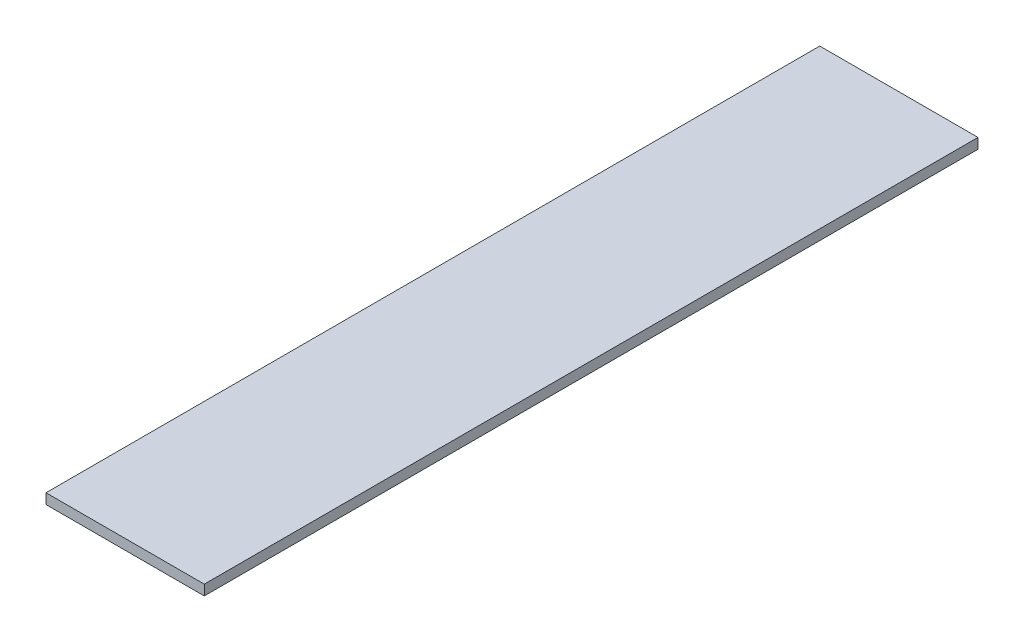
ISO-10303-21;
HEADER;
FILE_DESCRIPTION(('STEP AP214'),'2;1');
FILE_NAME('part.step','',(''),(''),'','','');
FILE_SCHEMA(('AUTOMOTIVE_DESIGN { 1 0 10303 214 1 1 1 1 }'));
ENDSEC;
DATA;
#1=APPLICATION_CONTEXT('core data for automotive mechanical design processes');
#2=APPLICATION_PROTOCOL_DEFINITION('international standard','automotive_design',2000,#1);
#3=PRODUCT_CONTEXT('',#1,'mechanical');
#4=PRODUCT('Part','Part','',(#3));
#5=PRODUCT_RELATED_PRODUCT_CATEGORY('part','',(#4));
#6=PRODUCT_DEFINITION_FORMATION('','',#4);
#7=PRODUCT_DEFINITION_CONTEXT('part definition',#1,'design');
#8=PRODUCT_DEFINITION('design','',#6,#7);
#9=PRODUCT_DEFINITION_SHAPE('','',#8);
#10=(LENGTH_UNIT() NAMED_UNIT(*) SI_UNIT(.MILLI.,.METRE.));
#11=(NAMED_UNIT(*) PLANE_ANGLE_UNIT() SI_UNIT($,.RADIAN.));
#12=(NAMED_UNIT(*) SI_UNIT($,.STERADIAN.) SOLID_ANGLE_UNIT());
#13=UNCERTAINTY_MEASURE_WITH_UNIT(LENGTH_MEASURE(1.E-05),#10,'distance_accuracy_value','');
#14=(GEOMETRIC_REPRESENTATION_CONTEXT(3) GLOBAL_UNCERTAINTY_ASSIGNED_CONTEXT((#13)) GLOBAL_UNIT_ASSIGNED_CONTEXT((#10,
#11,#12)) REPRESENTATION_CONTEXT('',''));
#15=CARTESIAN_POINT('',(0.,0.,0.));
#16=DIRECTION('',(0.,0.,1.));
#17=DIRECTION('',(1.,0.,0.));
#18=AXIS2_PLACEMENT_3D('',#15,#16,#17);
#19=CARTESIAN_POINT('',(42.8625,5.55625,-209.55));
#20=DIRECTION('',(-1.,0.,0.));
#21=DIRECTION('',(0.,0.,1.));
#22=AXIS2_PLACEMENT_3D('',#19,#20,#21);
#23=PLANE('',#22);
#24=DIRECTION('',(0.,0.,-1.));
#25=VECTOR('',#24,1.);
#26=CARTESIAN_POINT('',(42.8625,0.,-209.55));
#27=LINE('',#26,#25);
#28=CARTESIAN_POINT('',(42.8625,0.,209.55));
#29=VERTEX_POINT('',#28);
#30=CARTESIAN_POINT('',(42.8625,0.,-209.55));
#31=VERTEX_POINT('',#30);
#32=EDGE_CURVE('E100',#29,#31,#27,.T.);
#33=ORIENTED_EDGE('',*,*,#32,.T.);
#34=DIRECTION('',(0.,-1.,0.));
#35=VECTOR('',#34,1.);
#36=CARTESIAN_POINT('',(42.8625,5.55625,-209.55));
#37=LINE('',#36,#35);
#38=CARTESIAN_POINT('',(42.8625,5.55625,-209.55));
#39=VERTEX_POINT('',#38);
#40=EDGE_CURVE('E11',#39,#31,#37,.T.);
#41=ORIENTED_EDGE('',*,*,#40,.F.);
#42=DIRECTION('',(0.,0.,-1.));
#43=VECTOR('',#42,1.);
#44=CARTESIAN_POINT('',(42.8625,5.55625,-209.55));
#45=LINE('',#44,#43);
#46=CARTESIAN_POINT('',(42.8625,5.55625,209.55));
#47=VERTEX_POINT('',#46);
#48=EDGE_CURVE('E88',#47,#39,#45,.T.);
#49=ORIENTED_EDGE('',*,*,#48,.F.);
#50=DIRECTION('',(0.,-1.,0.));
#51=VECTOR('',#50,1.);
#52=CARTESIAN_POINT('',(42.8625,5.55625,209.55));
#53=LINE('',#52,#51);
#54=EDGE_CURVE('E96',#47,#29,#53,.T.);
#55=ORIENTED_EDGE('',*,*,#54,.T.);
#56=EDGE_LOOP('',(#33,#41,#49,#55));
#57=FACE_BOUND('',#56,.T.);
#58=ADVANCED_FACE('F37',(#57),#23,.F.);
#59=CARTESIAN_POINT('',(-42.8625,5.55625,-209.55));
#60=DIRECTION('',(0.,0.,1.));
#61=DIRECTION('',(1.,0.,0.));
#62=AXIS2_PLACEMENT_3D('',#59,#60,#61);
#63=PLANE('',#62);
#64=DIRECTION('',(-1.,0.,0.));
#65=VECTOR('',#64,1.);
#66=CARTESIAN_POINT('',(-42.8625,0.,-209.55));
#67=LINE('',#66,#65);
#68=CARTESIAN_POINT('',(-42.8625,0.,-209.55));
#69=VERTEX_POINT('',#68);
#70=EDGE_CURVE('E92',#31,#69,#67,.T.);
#71=ORIENTED_EDGE('',*,*,#70,.T.);
#72=DIRECTION('',(0.,-1.,0.));
#73=VECTOR('',#72,1.);
#74=CARTESIAN_POINT('',(-42.8625,5.55625,-209.55));
#75=LINE('',#74,#73);
#76=CARTESIAN_POINT('',(-42.8625,5.55625,-209.55));
#77=VERTEX_POINT('',#76);
#78=EDGE_CURVE('E45',#77,#69,#75,.T.);
#79=ORIENTED_EDGE('',*,*,#78,.F.);
#80=DIRECTION('',(-1.,0.,0.));
#81=VECTOR('',#80,1.);
#82=CARTESIAN_POINT('',(-42.8625,5.55625,-209.55));
#83=LINE('',#82,#81);
#84=EDGE_CURVE('E83',#39,#77,#83,.T.);
#85=ORIENTED_EDGE('',*,*,#84,.F.);
#86=ORIENTED_EDGE('',*,*,#40,.T.);
#87=EDGE_LOOP('',(#71,#79,#85,#86));
#88=FACE_BOUND('',#87,.T.);
#89=ADVANCED_FACE('F91',(#88),#63,.F.);
#90=CARTESIAN_POINT('',(-42.8625,5.55625,-209.55));
#91=DIRECTION('',(1.,0.,0.));
#92=DIRECTION('',(0.,0.,-1.));
#93=AXIS2_PLACEMENT_3D('',#90,#91,#92);
#94=PLANE('',#93);
#95=DIRECTION('',(0.,0.,1.));
#96=VECTOR('',#95,1.);
#97=CARTESIAN_POINT('',(-42.8625,0.,-209.55));
#98=LINE('',#97,#96);
#99=CARTESIAN_POINT('',(-42.8625,0.,209.55));
#100=VERTEX_POINT('',#99);
#101=EDGE_CURVE('E70',#69,#100,#98,.T.);
#102=ORIENTED_EDGE('',*,*,#101,.T.);
#103=DIRECTION('',(0.,-1.,0.));
#104=VECTOR('',#103,1.);
#105=CARTESIAN_POINT('',(-42.8625,5.55625,209.55));
#106=LINE('',#105,#104);
#107=CARTESIAN_POINT('',(-42.8625,5.55625,209.55));
#108=VERTEX_POINT('',#107);
#109=EDGE_CURVE('E93',#108,#100,#106,.T.);
#110=ORIENTED_EDGE('',*,*,#109,.F.);
#111=DIRECTION('',(0.,0.,1.));
#112=VECTOR('',#111,1.);
#113=CARTESIAN_POINT('',(-42.8625,5.55625,-209.55));
#114=LINE('',#113,#112);
#115=EDGE_CURVE('E86',#77,#108,#114,.T.);
#116=ORIENTED_EDGE('',*,*,#115,.F.);
#117=ORIENTED_EDGE('',*,*,#78,.T.);
#118=EDGE_LOOP('',(#102,#110,#116,#117));
#119=FACE_BOUND('',#118,.T.);
#120=ADVANCED_FACE('F94',(#119),#94,.F.);
#121=CARTESIAN_POINT('',(-42.8625,5.55625,209.55));
#122=DIRECTION('',(0.,0.,-1.));
#123=DIRECTION('',(-1.,0.,0.));
#124=AXIS2_PLACEMENT_3D('',#121,#122,#123);
#125=PLANE('',#124);
#126=DIRECTION('',(1.,0.,0.));
#127=VECTOR('',#126,1.);
#128=CARTESIAN_POINT('',(-42.8625,0.,209.55));
#129=LINE('',#128,#127);
#130=EDGE_CURVE('E76',#100,#29,#129,.T.);
#131=ORIENTED_EDGE('',*,*,#130,.T.);
#132=ORIENTED_EDGE('',*,*,#54,.F.);
#133=DIRECTION('',(1.,0.,0.));
#134=VECTOR('',#133,1.);
#135=CARTESIAN_POINT('',(-42.8625,5.55625,209.55));
#136=LINE('',#135,#134);
#137=EDGE_CURVE('E53',#108,#47,#136,.T.);
#138=ORIENTED_EDGE('',*,*,#137,.F.);
#139=ORIENTED_EDGE('',*,*,#109,.T.);
#140=EDGE_LOOP('',(#131,#132,#138,#139));
#141=FACE_BOUND('',#140,.T.);
#142=ADVANCED_FACE('F107',(#141),#125,.F.);
#143=CARTESIAN_POINT('',(0.,5.55625,0.));
#144=DIRECTION('',(0.,1.,0.));
#145=DIRECTION('',(0.,0.,1.));
#146=AXIS2_PLACEMENT_3D('',#143,#144,#145);
#147=PLANE('',#146);
#148=ORIENTED_EDGE('',*,*,#48,.T.);
#149=ORIENTED_EDGE('',*,*,#84,.T.);
#150=ORIENTED_EDGE('',*,*,#115,.T.);
#151=ORIENTED_EDGE('',*,*,#137,.T.);
#152=EDGE_LOOP('',(#148,#149,#150,#151));
#153=FACE_BOUND('',#152,.T.);
#154=ADVANCED_FACE('F84',(#153),#147,.T.);
#155=CARTESIAN_POINT('',(0.,0.,0.));
#156=DIRECTION('',(0.,1.,0.));
#157=DIRECTION('',(0.,0.,1.));
#158=AXIS2_PLACEMENT_3D('',#155,#156,#157);
#159=PLANE('',#158);
#160=ORIENTED_EDGE('',*,*,#32,.F.);
#161=ORIENTED_EDGE('',*,*,#130,.F.);
#162=ORIENTED_EDGE('',*,*,#101,.F.);
#163=ORIENTED_EDGE('',*,*,#70,.F.);
#164=EDGE_LOOP('',(#160,#161,#162,#163));
#165=FACE_BOUND('',#164,.T.);
#166=ADVANCED_FACE('F110',(#165),#159,.F.);
#167=CLOSED_SHELL('',(#58,#89,#120,#142,#154,#166));
#168=MANIFOLD_SOLID_BREP('B2',#167);
#169=ADVANCED_BREP_SHAPE_REPRESENTATION('',(#18,#168),#14);
#170=SHAPE_DEFINITION_REPRESENTATION(#9,#169);
ENDSEC;
END-ISO-10303-21;
